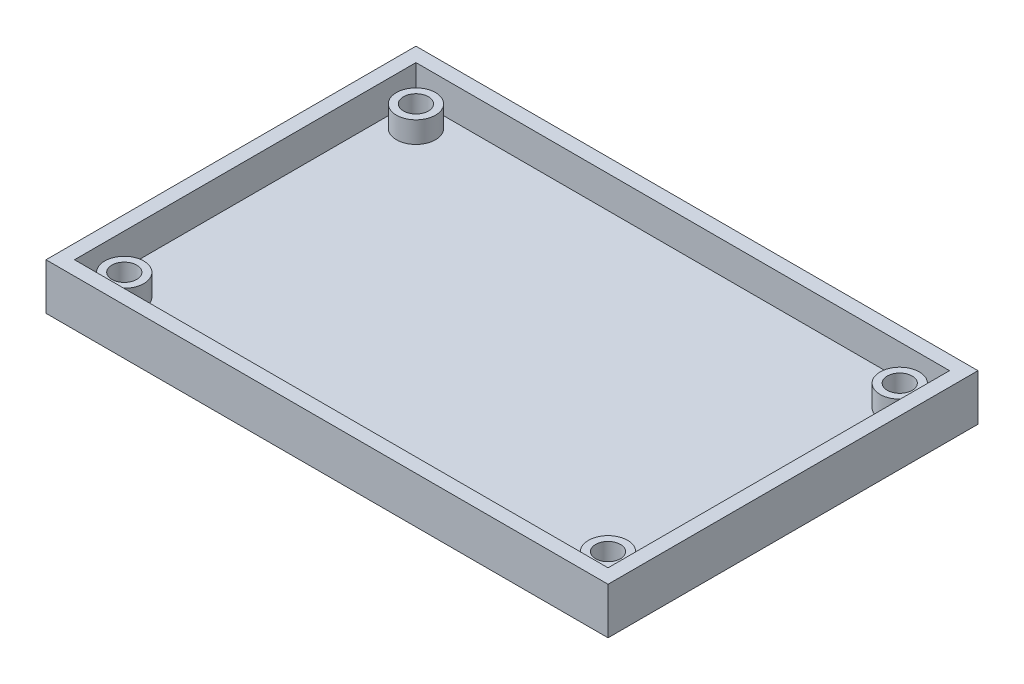
ISO-10303-21;
HEADER;
FILE_DESCRIPTION(('STEP AP214'),'2;1');
FILE_NAME('part.step','',(''),(''),'','','');
FILE_SCHEMA(('AUTOMOTIVE_DESIGN { 1 0 10303 214 1 1 1 1 }'));
ENDSEC;
DATA;
#1=APPLICATION_CONTEXT('core data for automotive mechanical design processes');
#2=APPLICATION_PROTOCOL_DEFINITION('international standard','automotive_design',2000,#1);
#3=PRODUCT_CONTEXT('',#1,'mechanical');
#4=PRODUCT('Part','Part','',(#3));
#5=PRODUCT_RELATED_PRODUCT_CATEGORY('part','',(#4));
#6=PRODUCT_DEFINITION_FORMATION('','',#4);
#7=PRODUCT_DEFINITION_CONTEXT('part definition',#1,'design');
#8=PRODUCT_DEFINITION('design','',#6,#7);
#9=PRODUCT_DEFINITION_SHAPE('','',#8);
#10=(LENGTH_UNIT() NAMED_UNIT(*) SI_UNIT(.MILLI.,.METRE.));
#11=(NAMED_UNIT(*) PLANE_ANGLE_UNIT() SI_UNIT($,.RADIAN.));
#12=(NAMED_UNIT(*) SI_UNIT($,.STERADIAN.) SOLID_ANGLE_UNIT());
#13=UNCERTAINTY_MEASURE_WITH_UNIT(LENGTH_MEASURE(1.E-05),#10,'distance_accuracy_value','');
#14=(GEOMETRIC_REPRESENTATION_CONTEXT(3) GLOBAL_UNCERTAINTY_ASSIGNED_CONTEXT((#13)) GLOBAL_UNIT_ASSIGNED_CONTEXT((#10,
#11,#12)) REPRESENTATION_CONTEXT('',''));
#15=CARTESIAN_POINT('',(0.,0.,0.));
#16=DIRECTION('',(0.,0.,1.));
#17=DIRECTION('',(1.,0.,0.));
#18=AXIS2_PLACEMENT_3D('',#15,#16,#17);
#19=CARTESIAN_POINT('',(0.,4.524,0.));
#20=DIRECTION('',(0.,1.,0.));
#21=DIRECTION('',(0.,0.,1.));
#22=AXIS2_PLACEMENT_3D('',#19,#20,#21);
#23=PLANE('',#22);
#24=DIRECTION('',(0.,0.,-1.));
#25=VECTOR('',#24,1.);
#26=CARTESIAN_POINT('',(39.5,4.524,-26.));
#27=LINE('',#26,#25);
#28=CARTESIAN_POINT('',(39.5,4.524,26.));
#29=VERTEX_POINT('',#28);
#30=CARTESIAN_POINT('',(39.5,4.524,-26.));
#31=VERTEX_POINT('',#30);
#32=EDGE_CURVE('E159',#29,#31,#27,.T.);
#33=ORIENTED_EDGE('',*,*,#32,.T.);
#34=DIRECTION('',(-1.,0.,0.));
#35=VECTOR('',#34,1.);
#36=CARTESIAN_POINT('',(-39.5,4.524,-26.));
#37=LINE('',#36,#35);
#38=CARTESIAN_POINT('',(-39.5,4.524,-26.));
#39=VERTEX_POINT('',#38);
#40=EDGE_CURVE('E161',#31,#39,#37,.T.);
#41=ORIENTED_EDGE('',*,*,#40,.T.);
#42=DIRECTION('',(0.,0.,1.));
#43=VECTOR('',#42,1.);
#44=CARTESIAN_POINT('',(-39.5,4.524,-26.));
#45=LINE('',#44,#43);
#46=CARTESIAN_POINT('',(-39.5,4.524,26.));
#47=VERTEX_POINT('',#46);
#48=EDGE_CURVE('E106',#39,#47,#45,.T.);
#49=ORIENTED_EDGE('',*,*,#48,.T.);
#50=DIRECTION('',(1.,0.,0.));
#51=VECTOR('',#50,1.);
#52=CARTESIAN_POINT('',(-39.5,4.524,26.));
#53=LINE('',#52,#51);
#54=EDGE_CURVE('E58',#47,#29,#53,.T.);
#55=ORIENTED_EDGE('',*,*,#54,.T.);
#56=EDGE_LOOP('',(#33,#41,#49,#55));
#57=FACE_BOUND('',#56,.T.);
#58=DIRECTION('',(-1.,0.,0.));
#59=VECTOR('',#58,1.);
#60=CARTESIAN_POINT('',(-37.5,4.524,-24.));
#61=LINE('',#60,#59);
#62=CARTESIAN_POINT('',(37.5,4.524,-24.));
#63=VERTEX_POINT('',#62);
#64=CARTESIAN_POINT('',(-37.5,4.524,-24.));
#65=VERTEX_POINT('',#64);
#66=EDGE_CURVE('E134',#63,#65,#61,.T.);
#67=ORIENTED_EDGE('',*,*,#66,.F.);
#68=DIRECTION('',(0.,0.,-1.));
#69=VECTOR('',#68,1.);
#70=CARTESIAN_POINT('',(37.5,4.524,-24.));
#71=LINE('',#70,#69);
#72=CARTESIAN_POINT('',(37.5,4.524,24.));
#73=VERTEX_POINT('',#72);
#74=EDGE_CURVE('E132',#73,#63,#71,.T.);
#75=ORIENTED_EDGE('',*,*,#74,.F.);
#76=DIRECTION('',(1.,0.,0.));
#77=VECTOR('',#76,1.);
#78=CARTESIAN_POINT('',(-37.5,4.524,24.));
#79=LINE('',#78,#77);
#80=CARTESIAN_POINT('',(-37.5,4.524,24.));
#81=VERTEX_POINT('',#80);
#82=EDGE_CURVE('E139',#81,#73,#79,.T.);
#83=ORIENTED_EDGE('',*,*,#82,.F.);
#84=DIRECTION('',(0.,0.,1.));
#85=VECTOR('',#84,1.);
#86=CARTESIAN_POINT('',(-37.5,4.524,-24.));
#87=LINE('',#86,#85);
#88=EDGE_CURVE('E137',#65,#81,#87,.T.);
#89=ORIENTED_EDGE('',*,*,#88,.F.);
#90=EDGE_LOOP('',(#67,#75,#83,#89));
#91=FACE_BOUND('',#90,.T.);
#92=ADVANCED_FACE('F35',(#57,#91),#23,.T.);
#93=CARTESIAN_POINT('',(39.5,4.524,-26.));
#94=DIRECTION('',(-1.,0.,0.));
#95=DIRECTION('',(0.,0.,1.));
#96=AXIS2_PLACEMENT_3D('',#93,#94,#95);
#97=PLANE('',#96);
#98=DIRECTION('',(0.,-1.,0.));
#99=VECTOR('',#98,1.);
#100=CARTESIAN_POINT('',(39.5,4.524,26.));
#101=LINE('',#100,#99);
#102=CARTESIAN_POINT('',(39.5,-2.,26.));
#103=VERTEX_POINT('',#102);
#104=EDGE_CURVE('E165',#29,#103,#101,.T.);
#105=ORIENTED_EDGE('',*,*,#104,.T.);
#106=DIRECTION('',(0.,0.,1.));
#107=VECTOR('',#106,1.);
#108=CARTESIAN_POINT('',(39.5,-2.,26.));
#109=LINE('',#108,#107);
#110=CARTESIAN_POINT('',(39.5,-2.,-26.));
#111=VERTEX_POINT('',#110);
#112=EDGE_CURVE('E116',#111,#103,#109,.T.);
#113=ORIENTED_EDGE('',*,*,#112,.F.);
#114=DIRECTION('',(0.,-1.,0.));
#115=VECTOR('',#114,1.);
#116=CARTESIAN_POINT('',(39.5,4.524,-26.));
#117=LINE('',#116,#115);
#118=EDGE_CURVE('E11',#31,#111,#117,.T.);
#119=ORIENTED_EDGE('',*,*,#118,.F.);
#120=ORIENTED_EDGE('',*,*,#32,.F.);
#121=EDGE_LOOP('',(#105,#113,#119,#120));
#122=FACE_BOUND('',#121,.T.);
#123=ADVANCED_FACE('F37',(#122),#97,.F.);
#124=CARTESIAN_POINT('',(-39.5,4.524,-26.));
#125=DIRECTION('',(0.,0.,1.));
#126=DIRECTION('',(1.,0.,0.));
#127=AXIS2_PLACEMENT_3D('',#124,#125,#126);
#128=PLANE('',#127);
#129=ORIENTED_EDGE('',*,*,#118,.T.);
#130=DIRECTION('',(1.,0.,0.));
#131=VECTOR('',#130,1.);
#132=CARTESIAN_POINT('',(39.5,-2.,-26.));
#133=LINE('',#132,#131);
#134=CARTESIAN_POINT('',(-39.5,-2.,-26.));
#135=VERTEX_POINT('',#134);
#136=EDGE_CURVE('E110',#135,#111,#133,.T.);
#137=ORIENTED_EDGE('',*,*,#136,.F.);
#138=DIRECTION('',(0.,-1.,0.));
#139=VECTOR('',#138,1.);
#140=CARTESIAN_POINT('',(-39.5,4.524,-26.));
#141=LINE('',#140,#139);
#142=EDGE_CURVE('E43',#39,#135,#141,.T.);
#143=ORIENTED_EDGE('',*,*,#142,.F.);
#144=ORIENTED_EDGE('',*,*,#40,.F.);
#145=EDGE_LOOP('',(#129,#137,#143,#144));
#146=FACE_BOUND('',#145,.T.);
#147=ADVANCED_FACE('F111',(#146),#128,.F.);
#148=CARTESIAN_POINT('',(-39.5,4.524,-26.));
#149=DIRECTION('',(1.,0.,0.));
#150=DIRECTION('',(0.,0.,-1.));
#151=AXIS2_PLACEMENT_3D('',#148,#149,#150);
#152=PLANE('',#151);
#153=ORIENTED_EDGE('',*,*,#142,.T.);
#154=DIRECTION('',(0.,0.,-1.));
#155=VECTOR('',#154,1.);
#156=CARTESIAN_POINT('',(-39.5,-2.,26.));
#157=LINE('',#156,#155);
#158=CARTESIAN_POINT('',(-39.5,-2.,26.));
#159=VERTEX_POINT('',#158);
#160=EDGE_CURVE('E105',#159,#135,#157,.T.);
#161=ORIENTED_EDGE('',*,*,#160,.F.);
#162=DIRECTION('',(0.,-1.,0.));
#163=VECTOR('',#162,1.);
#164=CARTESIAN_POINT('',(-39.5,4.524,26.));
#165=LINE('',#164,#163);
#166=EDGE_CURVE('E108',#47,#159,#165,.T.);
#167=ORIENTED_EDGE('',*,*,#166,.F.);
#168=ORIENTED_EDGE('',*,*,#48,.F.);
#169=EDGE_LOOP('',(#153,#161,#167,#168));
#170=FACE_BOUND('',#169,.T.);
#171=ADVANCED_FACE('F102',(#170),#152,.F.);
#172=CARTESIAN_POINT('',(-39.5,4.524,26.));
#173=DIRECTION('',(0.,0.,-1.));
#174=DIRECTION('',(-1.,0.,0.));
#175=AXIS2_PLACEMENT_3D('',#172,#173,#174);
#176=PLANE('',#175);
#177=ORIENTED_EDGE('',*,*,#166,.T.);
#178=DIRECTION('',(-1.,0.,0.));
#179=VECTOR('',#178,1.);
#180=CARTESIAN_POINT('',(39.5,-2.,26.));
#181=LINE('',#180,#179);
#182=EDGE_CURVE('E121',#103,#159,#181,.T.);
#183=ORIENTED_EDGE('',*,*,#182,.F.);
#184=ORIENTED_EDGE('',*,*,#104,.F.);
#185=ORIENTED_EDGE('',*,*,#54,.F.);
#186=EDGE_LOOP('',(#177,#183,#184,#185));
#187=FACE_BOUND('',#186,.T.);
#188=ADVANCED_FACE('F168',(#187),#176,.F.);
#189=CARTESIAN_POINT('',(37.5,4.524,-24.));
#190=DIRECTION('',(-1.,0.,0.));
#191=DIRECTION('',(0.,0.,1.));
#192=AXIS2_PLACEMENT_3D('',#189,#190,#191);
#193=PLANE('',#192);
#194=DIRECTION('',(0.,0.,-1.));
#195=VECTOR('',#194,1.);
#196=CARTESIAN_POINT('',(37.5,0.,-24.));
#197=LINE('',#196,#195);
#198=CARTESIAN_POINT('',(37.5,0.,24.));
#199=VERTEX_POINT('',#198);
#200=CARTESIAN_POINT('',(37.5,0.,-24.));
#201=VERTEX_POINT('',#200);
#202=EDGE_CURVE('E131',#199,#201,#197,.T.);
#203=ORIENTED_EDGE('',*,*,#202,.F.);
#204=DIRECTION('',(0.,-1.,0.));
#205=VECTOR('',#204,1.);
#206=CARTESIAN_POINT('',(37.5,4.524,24.));
#207=LINE('',#206,#205);
#208=EDGE_CURVE('E141',#73,#199,#207,.T.);
#209=ORIENTED_EDGE('',*,*,#208,.F.);
#210=ORIENTED_EDGE('',*,*,#74,.T.);
#211=DIRECTION('',(0.,-1.,0.));
#212=VECTOR('',#211,1.);
#213=CARTESIAN_POINT('',(37.5,4.524,-24.));
#214=LINE('',#213,#212);
#215=EDGE_CURVE('E156',#63,#201,#214,.T.);
#216=ORIENTED_EDGE('',*,*,#215,.T.);
#217=EDGE_LOOP('',(#203,#209,#210,#216));
#218=FACE_BOUND('',#217,.T.);
#219=ADVANCED_FACE('F189',(#218),#193,.T.);
#220=CARTESIAN_POINT('',(-37.5,4.524,-24.));
#221=DIRECTION('',(0.,0.,1.));
#222=DIRECTION('',(1.,0.,0.));
#223=AXIS2_PLACEMENT_3D('',#220,#221,#222);
#224=PLANE('',#223);
#225=DIRECTION('',(-1.,0.,0.));
#226=VECTOR('',#225,1.);
#227=CARTESIAN_POINT('',(-37.5,0.,-24.));
#228=LINE('',#227,#226);
#229=CARTESIAN_POINT('',(-37.5,0.,-24.));
#230=VERTEX_POINT('',#229);
#231=EDGE_CURVE('E144',#201,#230,#228,.T.);
#232=ORIENTED_EDGE('',*,*,#231,.F.);
#233=ORIENTED_EDGE('',*,*,#215,.F.);
#234=ORIENTED_EDGE('',*,*,#66,.T.);
#235=DIRECTION('',(0.,-1.,0.));
#236=VECTOR('',#235,1.);
#237=CARTESIAN_POINT('',(-37.5,4.524,-24.));
#238=LINE('',#237,#236);
#239=EDGE_CURVE('E154',#65,#230,#238,.T.);
#240=ORIENTED_EDGE('',*,*,#239,.T.);
#241=EDGE_LOOP('',(#232,#233,#234,#240));
#242=FACE_BOUND('',#241,.T.);
#243=ADVANCED_FACE('F181',(#242),#224,.T.);
#244=CARTESIAN_POINT('',(-37.5,4.524,-24.));
#245=DIRECTION('',(1.,0.,0.));
#246=DIRECTION('',(0.,0.,-1.));
#247=AXIS2_PLACEMENT_3D('',#244,#245,#246);
#248=PLANE('',#247);
#249=DIRECTION('',(0.,0.,1.));
#250=VECTOR('',#249,1.);
#251=CARTESIAN_POINT('',(-37.5,0.,-24.));
#252=LINE('',#251,#250);
#253=CARTESIAN_POINT('',(-37.5,0.,24.));
#254=VERTEX_POINT('',#253);
#255=EDGE_CURVE('E147',#230,#254,#252,.T.);
#256=ORIENTED_EDGE('',*,*,#255,.F.);
#257=ORIENTED_EDGE('',*,*,#239,.F.);
#258=ORIENTED_EDGE('',*,*,#88,.T.);
#259=DIRECTION('',(0.,-1.,0.));
#260=VECTOR('',#259,1.);
#261=CARTESIAN_POINT('',(-37.5,4.524,24.));
#262=LINE('',#261,#260);
#263=EDGE_CURVE('E50',#81,#254,#262,.T.);
#264=ORIENTED_EDGE('',*,*,#263,.T.);
#265=EDGE_LOOP('',(#256,#257,#258,#264));
#266=FACE_BOUND('',#265,.T.);
#267=ADVANCED_FACE('F184',(#266),#248,.T.);
#268=CARTESIAN_POINT('',(-37.5,4.524,24.));
#269=DIRECTION('',(0.,0.,-1.));
#270=DIRECTION('',(-1.,0.,0.));
#271=AXIS2_PLACEMENT_3D('',#268,#269,#270);
#272=PLANE('',#271);
#273=DIRECTION('',(1.,0.,0.));
#274=VECTOR('',#273,1.);
#275=CARTESIAN_POINT('',(-37.5,0.,24.));
#276=LINE('',#275,#274);
#277=EDGE_CURVE('E135',#254,#199,#276,.T.);
#278=ORIENTED_EDGE('',*,*,#277,.F.);
#279=ORIENTED_EDGE('',*,*,#263,.F.);
#280=ORIENTED_EDGE('',*,*,#82,.T.);
#281=ORIENTED_EDGE('',*,*,#208,.T.);
#282=EDGE_LOOP('',(#278,#279,#280,#281));
#283=FACE_BOUND('',#282,.T.);
#284=ADVANCED_FACE('F191',(#283),#272,.T.);
#285=CARTESIAN_POINT('',(0.,0.,0.));
#286=DIRECTION('',(0.,1.,0.));
#287=DIRECTION('',(0.,0.,1.));
#288=AXIS2_PLACEMENT_3D('',#285,#286,#287);
#289=PLANE('',#288);
#290=CARTESIAN_POINT('',(-34.,0.,-20.5));
#291=DIRECTION('',(0.,1.,0.));
#292=DIRECTION('',(0.,0.,1.));
#293=AXIS2_PLACEMENT_3D('',#290,#291,#292);
#294=CIRCLE('',#293,2.75000000000001);
#295=CARTESIAN_POINT('',(-34.,0.,-17.75));
#296=VERTEX_POINT('',#295);
#297=EDGE_CURVE('E490',#296,#296,#294,.T.);
#298=ORIENTED_EDGE('',*,*,#297,.F.);
#299=EDGE_LOOP('',(#298));
#300=FACE_BOUND('',#299,.T.);
#301=CARTESIAN_POINT('',(34.,0.,-20.5));
#302=DIRECTION('',(0.,1.,0.));
#303=DIRECTION('',(0.,0.,1.));
#304=AXIS2_PLACEMENT_3D('',#301,#302,#303);
#305=CIRCLE('',#304,2.75);
#306=CARTESIAN_POINT('',(34.,0.,-17.75));
#307=VERTEX_POINT('',#306);
#308=EDGE_CURVE('E505',#307,#307,#305,.T.);
#309=ORIENTED_EDGE('',*,*,#308,.F.);
#310=EDGE_LOOP('',(#309));
#311=FACE_BOUND('',#310,.T.);
#312=CARTESIAN_POINT('',(34.,0.,20.5));
#313=DIRECTION('',(0.,1.,0.));
#314=DIRECTION('',(0.,0.,1.));
#315=AXIS2_PLACEMENT_3D('',#312,#313,#314);
#316=CIRCLE('',#315,2.75);
#317=CARTESIAN_POINT('',(34.,0.,23.25));
#318=VERTEX_POINT('',#317);
#319=EDGE_CURVE('E520',#318,#318,#316,.T.);
#320=ORIENTED_EDGE('',*,*,#319,.F.);
#321=EDGE_LOOP('',(#320));
#322=FACE_BOUND('',#321,.T.);
#323=CARTESIAN_POINT('',(-34.,0.,20.5));
#324=DIRECTION('',(0.,1.,0.));
#325=DIRECTION('',(0.,0.,1.));
#326=AXIS2_PLACEMENT_3D('',#323,#324,#325);
#327=CIRCLE('',#326,2.75);
#328=CARTESIAN_POINT('',(-34.,0.,23.25));
#329=VERTEX_POINT('',#328);
#330=EDGE_CURVE('E535',#329,#329,#327,.T.);
#331=ORIENTED_EDGE('',*,*,#330,.F.);
#332=EDGE_LOOP('',(#331));
#333=FACE_BOUND('',#332,.T.);
#334=ORIENTED_EDGE('',*,*,#277,.T.);
#335=ORIENTED_EDGE('',*,*,#202,.T.);
#336=ORIENTED_EDGE('',*,*,#231,.T.);
#337=ORIENTED_EDGE('',*,*,#255,.T.);
#338=EDGE_LOOP('',(#334,#335,#336,#337));
#339=FACE_BOUND('',#338,.T.);
#340=ADVANCED_FACE('F186',(#300,#311,#322,#333,#339),#289,.T.);
#341=CARTESIAN_POINT('',(0.,-2.,0.));
#342=DIRECTION('',(0.,1.,0.));
#343=DIRECTION('',(0.,0.,1.));
#344=AXIS2_PLACEMENT_3D('',#341,#342,#343);
#345=PLANE('',#344);
#346=CARTESIAN_POINT('',(34.,-2.,-20.5));
#347=DIRECTION('',(0.,1.,0.));
#348=DIRECTION('',(0.,0.,1.));
#349=AXIS2_PLACEMENT_3D('',#346,#347,#348);
#350=CIRCLE('',#349,1.9);
#351=CARTESIAN_POINT('',(34.,-2.,-18.6));
#352=VERTEX_POINT('',#351);
#353=EDGE_CURVE('E125',#352,#352,#350,.T.);
#354=ORIENTED_EDGE('',*,*,#353,.T.);
#355=EDGE_LOOP('',(#354));
#356=FACE_BOUND('',#355,.T.);
#357=CARTESIAN_POINT('',(34.,-2.,20.5));
#358=DIRECTION('',(0.,1.,0.));
#359=DIRECTION('',(0.,0.,1.));
#360=AXIS2_PLACEMENT_3D('',#357,#358,#359);
#361=CIRCLE('',#360,1.9);
#362=CARTESIAN_POINT('',(34.,-2.,22.4));
#363=VERTEX_POINT('',#362);
#364=EDGE_CURVE('E549',#363,#363,#361,.T.);
#365=ORIENTED_EDGE('',*,*,#364,.T.);
#366=EDGE_LOOP('',(#365));
#367=FACE_BOUND('',#366,.T.);
#368=CARTESIAN_POINT('',(-34.,-2.,20.5));
#369=DIRECTION('',(0.,1.,0.));
#370=DIRECTION('',(0.,0.,1.));
#371=AXIS2_PLACEMENT_3D('',#368,#369,#370);
#372=CIRCLE('',#371,1.9);
#373=CARTESIAN_POINT('',(-34.,-2.,22.4));
#374=VERTEX_POINT('',#373);
#375=EDGE_CURVE('E546',#374,#374,#372,.T.);
#376=ORIENTED_EDGE('',*,*,#375,.T.);
#377=EDGE_LOOP('',(#376));
#378=FACE_BOUND('',#377,.T.);
#379=CARTESIAN_POINT('',(-34.,-2.,-20.5));
#380=DIRECTION('',(0.,1.,0.));
#381=DIRECTION('',(0.,0.,1.));
#382=AXIS2_PLACEMENT_3D('',#379,#380,#381);
#383=CIRCLE('',#382,1.9);
#384=CARTESIAN_POINT('',(-34.,-2.,-18.6));
#385=VERTEX_POINT('',#384);
#386=EDGE_CURVE('E122',#385,#385,#383,.T.);
#387=ORIENTED_EDGE('',*,*,#386,.T.);
#388=EDGE_LOOP('',(#387));
#389=FACE_BOUND('',#388,.T.);
#390=ORIENTED_EDGE('',*,*,#160,.T.);
#391=ORIENTED_EDGE('',*,*,#136,.T.);
#392=ORIENTED_EDGE('',*,*,#112,.T.);
#393=ORIENTED_EDGE('',*,*,#182,.T.);
#394=EDGE_LOOP('',(#390,#391,#392,#393));
#395=FACE_BOUND('',#394,.T.);
#396=ADVANCED_FACE('F119',(#356,#367,#378,#389,#395),#345,.F.);
#397=CARTESIAN_POINT('',(-34.,-2.,-20.5));
#398=DIRECTION('',(0.,1.,0.));
#399=DIRECTION('',(0.,0.,1.));
#400=AXIS2_PLACEMENT_3D('',#397,#398,#399);
#401=CYLINDRICAL_SURFACE('',#400,1.9);
#402=ORIENTED_EDGE('',*,*,#386,.F.);
#403=EDGE_LOOP('',(#402));
#404=FACE_BOUND('',#403,.T.);
#405=CARTESIAN_POINT('',(-34.,0.,-20.5));
#406=DIRECTION('',(0.,1.,0.));
#407=DIRECTION('',(0.,0.,1.));
#408=AXIS2_PLACEMENT_3D('',#405,#406,#407);
#409=CIRCLE('',#408,1.9);
#410=CARTESIAN_POINT('',(-34.,0.,-18.6));
#411=VERTEX_POINT('',#410);
#412=EDGE_CURVE('E496',#411,#411,#409,.F.);
#413=ORIENTED_EDGE('',*,*,#412,.F.);
#414=EDGE_LOOP('',(#413));
#415=FACE_BOUND('',#414,.T.);
#416=ADVANCED_FACE('F274',(#404,#415),#401,.F.);
#417=CARTESIAN_POINT('',(-34.,-2.,20.5));
#418=DIRECTION('',(0.,1.,0.));
#419=DIRECTION('',(0.,0.,1.));
#420=AXIS2_PLACEMENT_3D('',#417,#418,#419);
#421=CYLINDRICAL_SURFACE('',#420,1.9);
#422=ORIENTED_EDGE('',*,*,#375,.F.);
#423=EDGE_LOOP('',(#422));
#424=FACE_BOUND('',#423,.T.);
#425=CARTESIAN_POINT('',(-34.,0.,20.5));
#426=DIRECTION('',(0.,1.,0.));
#427=DIRECTION('',(0.,0.,1.));
#428=AXIS2_PLACEMENT_3D('',#425,#426,#427);
#429=CIRCLE('',#428,1.9);
#430=CARTESIAN_POINT('',(-34.,0.,22.4));
#431=VERTEX_POINT('',#430);
#432=EDGE_CURVE('E541',#431,#431,#429,.F.);
#433=ORIENTED_EDGE('',*,*,#432,.F.);
#434=EDGE_LOOP('',(#433));
#435=FACE_BOUND('',#434,.T.);
#436=ADVANCED_FACE('F283',(#424,#435),#421,.F.);
#437=CARTESIAN_POINT('',(34.,-2.,20.5));
#438=DIRECTION('',(0.,1.,0.));
#439=DIRECTION('',(0.,0.,1.));
#440=AXIS2_PLACEMENT_3D('',#437,#438,#439);
#441=CYLINDRICAL_SURFACE('',#440,1.9);
#442=ORIENTED_EDGE('',*,*,#364,.F.);
#443=EDGE_LOOP('',(#442));
#444=FACE_BOUND('',#443,.T.);
#445=CARTESIAN_POINT('',(34.,0.,20.5));
#446=DIRECTION('',(0.,1.,0.));
#447=DIRECTION('',(0.,0.,1.));
#448=AXIS2_PLACEMENT_3D('',#445,#446,#447);
#449=CIRCLE('',#448,1.9);
#450=CARTESIAN_POINT('',(34.,0.,22.4));
#451=VERTEX_POINT('',#450);
#452=EDGE_CURVE('E526',#451,#451,#449,.F.);
#453=ORIENTED_EDGE('',*,*,#452,.F.);
#454=EDGE_LOOP('',(#453));
#455=FACE_BOUND('',#454,.T.);
#456=ADVANCED_FACE('F293',(#444,#455),#441,.F.);
#457=CARTESIAN_POINT('',(34.,-2.,-20.5));
#458=DIRECTION('',(0.,1.,0.));
#459=DIRECTION('',(0.,0.,1.));
#460=AXIS2_PLACEMENT_3D('',#457,#458,#459);
#461=CYLINDRICAL_SURFACE('',#460,1.9);
#462=ORIENTED_EDGE('',*,*,#353,.F.);
#463=EDGE_LOOP('',(#462));
#464=FACE_BOUND('',#463,.T.);
#465=CARTESIAN_POINT('',(34.,0.,-20.5));
#466=DIRECTION('',(0.,1.,0.));
#467=DIRECTION('',(0.,0.,1.));
#468=AXIS2_PLACEMENT_3D('',#465,#466,#467);
#469=CIRCLE('',#468,1.9);
#470=CARTESIAN_POINT('',(34.,0.,-18.6));
#471=VERTEX_POINT('',#470);
#472=EDGE_CURVE('E511',#471,#471,#469,.F.);
#473=ORIENTED_EDGE('',*,*,#472,.F.);
#474=EDGE_LOOP('',(#473));
#475=FACE_BOUND('',#474,.T.);
#476=ADVANCED_FACE('F303',(#464,#475),#461,.F.);
#477=CARTESIAN_POINT('',(-34.,0.,20.5));
#478=DIRECTION('',(0.,1.,0.));
#479=DIRECTION('',(0.,0.,1.));
#480=AXIS2_PLACEMENT_3D('',#477,#478,#479);
#481=PLANE('',#480);
#482=CARTESIAN_POINT('',(-34.,0.,20.5));
#483=DIRECTION('',(0.,1.,0.));
#484=DIRECTION('',(0.,0.,1.));
#485=AXIS2_PLACEMENT_3D('',#482,#483,#484);
#486=CIRCLE('',#485,1.75);
#487=CARTESIAN_POINT('',(-34.,0.,22.25));
#488=VERTEX_POINT('',#487);
#489=EDGE_CURVE('E531',#488,#488,#486,.T.);
#490=ORIENTED_EDGE('',*,*,#489,.T.);
#491=EDGE_LOOP('',(#490));
#492=FACE_BOUND('',#491,.T.);
#493=ORIENTED_EDGE('',*,*,#432,.T.);
#494=EDGE_LOOP('',(#493));
#495=FACE_BOUND('',#494,.T.);
#496=ADVANCED_FACE('F313',(#492,#495),#481,.F.);
#497=CARTESIAN_POINT('',(-34.,3.,20.5));
#498=DIRECTION('',(0.,1.,0.));
#499=DIRECTION('',(0.,0.,1.));
#500=AXIS2_PLACEMENT_3D('',#497,#498,#499);
#501=PLANE('',#500);
#502=CARTESIAN_POINT('',(-34.,3.,20.5));
#503=DIRECTION('',(0.,1.,0.));
#504=DIRECTION('',(0.,0.,1.));
#505=AXIS2_PLACEMENT_3D('',#502,#503,#504);
#506=CIRCLE('',#505,2.75);
#507=CARTESIAN_POINT('',(-34.,3.,23.25));
#508=VERTEX_POINT('',#507);
#509=EDGE_CURVE('E538',#508,#508,#506,.T.);
#510=ORIENTED_EDGE('',*,*,#509,.T.);
#511=EDGE_LOOP('',(#510));
#512=FACE_BOUND('',#511,.T.);
#513=CARTESIAN_POINT('',(-34.,3.,20.5));
#514=DIRECTION('',(0.,1.,0.));
#515=DIRECTION('',(0.,0.,1.));
#516=AXIS2_PLACEMENT_3D('',#513,#514,#515);
#517=CIRCLE('',#516,1.75);
#518=CARTESIAN_POINT('',(-34.,3.,22.25));
#519=VERTEX_POINT('',#518);
#520=EDGE_CURVE('E532',#519,#519,#517,.T.);
#521=ORIENTED_EDGE('',*,*,#520,.F.);
#522=EDGE_LOOP('',(#521));
#523=FACE_BOUND('',#522,.T.);
#524=ADVANCED_FACE('F328',(#512,#523),#501,.T.);
#525=CARTESIAN_POINT('',(-34.,3.,20.5));
#526=DIRECTION('',(0.,-1.,0.));
#527=DIRECTION('',(0.,0.,-1.));
#528=AXIS2_PLACEMENT_3D('',#525,#526,#527);
#529=CYLINDRICAL_SURFACE('',#528,2.75);
#530=ORIENTED_EDGE('',*,*,#509,.F.);
#531=EDGE_LOOP('',(#530));
#532=FACE_BOUND('',#531,.T.);
#533=ORIENTED_EDGE('',*,*,#330,.T.);
#534=EDGE_LOOP('',(#533));
#535=FACE_BOUND('',#534,.T.);
#536=ADVANCED_FACE('F338',(#532,#535),#529,.T.);
#537=CARTESIAN_POINT('',(-34.,3.,20.5));
#538=DIRECTION('',(0.,-1.,0.));
#539=DIRECTION('',(0.,0.,-1.));
#540=AXIS2_PLACEMENT_3D('',#537,#538,#539);
#541=CYLINDRICAL_SURFACE('',#540,1.75);
#542=ORIENTED_EDGE('',*,*,#520,.T.);
#543=EDGE_LOOP('',(#542));
#544=FACE_BOUND('',#543,.T.);
#545=ORIENTED_EDGE('',*,*,#489,.F.);
#546=EDGE_LOOP('',(#545));
#547=FACE_BOUND('',#546,.T.);
#548=ADVANCED_FACE('F348',(#544,#547),#541,.F.);
#549=CARTESIAN_POINT('',(34.,0.,20.5));
#550=DIRECTION('',(0.,1.,0.));
#551=DIRECTION('',(0.,0.,1.));
#552=AXIS2_PLACEMENT_3D('',#549,#550,#551);
#553=PLANE('',#552);
#554=CARTESIAN_POINT('',(34.,0.,20.5));
#555=DIRECTION('',(0.,1.,0.));
#556=DIRECTION('',(0.,0.,1.));
#557=AXIS2_PLACEMENT_3D('',#554,#555,#556);
#558=CIRCLE('',#557,1.75);
#559=CARTESIAN_POINT('',(34.,0.,22.25));
#560=VERTEX_POINT('',#559);
#561=EDGE_CURVE('E516',#560,#560,#558,.T.);
#562=ORIENTED_EDGE('',*,*,#561,.T.);
#563=EDGE_LOOP('',(#562));
#564=FACE_BOUND('',#563,.T.);
#565=ORIENTED_EDGE('',*,*,#452,.T.);
#566=EDGE_LOOP('',(#565));
#567=FACE_BOUND('',#566,.T.);
#568=ADVANCED_FACE('F358',(#564,#567),#553,.F.);
#569=CARTESIAN_POINT('',(34.,3.,20.5));
#570=DIRECTION('',(0.,1.,0.));
#571=DIRECTION('',(0.,0.,1.));
#572=AXIS2_PLACEMENT_3D('',#569,#570,#571);
#573=PLANE('',#572);
#574=CARTESIAN_POINT('',(34.,3.,20.5));
#575=DIRECTION('',(0.,1.,0.));
#576=DIRECTION('',(0.,0.,1.));
#577=AXIS2_PLACEMENT_3D('',#574,#575,#576);
#578=CIRCLE('',#577,2.75);
#579=CARTESIAN_POINT('',(34.,3.,23.25));
#580=VERTEX_POINT('',#579);
#581=EDGE_CURVE('E523',#580,#580,#578,.T.);
#582=ORIENTED_EDGE('',*,*,#581,.T.);
#583=EDGE_LOOP('',(#582));
#584=FACE_BOUND('',#583,.T.);
#585=CARTESIAN_POINT('',(34.,3.,20.5));
#586=DIRECTION('',(0.,1.,0.));
#587=DIRECTION('',(0.,0.,1.));
#588=AXIS2_PLACEMENT_3D('',#585,#586,#587);
#589=CIRCLE('',#588,1.75);
#590=CARTESIAN_POINT('',(34.,3.,22.25));
#591=VERTEX_POINT('',#590);
#592=EDGE_CURVE('E517',#591,#591,#589,.T.);
#593=ORIENTED_EDGE('',*,*,#592,.F.);
#594=EDGE_LOOP('',(#593));
#595=FACE_BOUND('',#594,.T.);
#596=ADVANCED_FACE('F368',(#584,#595),#573,.T.);
#597=CARTESIAN_POINT('',(34.,3.,20.5));
#598=DIRECTION('',(0.,-1.,0.));
#599=DIRECTION('',(0.,0.,-1.));
#600=AXIS2_PLACEMENT_3D('',#597,#598,#599);
#601=CYLINDRICAL_SURFACE('',#600,2.75);
#602=ORIENTED_EDGE('',*,*,#581,.F.);
#603=EDGE_LOOP('',(#602));
#604=FACE_BOUND('',#603,.T.);
#605=ORIENTED_EDGE('',*,*,#319,.T.);
#606=EDGE_LOOP('',(#605));
#607=FACE_BOUND('',#606,.T.);
#608=ADVANCED_FACE('F378',(#604,#607),#601,.T.);
#609=CARTESIAN_POINT('',(34.,3.,20.5));
#610=DIRECTION('',(0.,-1.,0.));
#611=DIRECTION('',(0.,0.,-1.));
#612=AXIS2_PLACEMENT_3D('',#609,#610,#611);
#613=CYLINDRICAL_SURFACE('',#612,1.75);
#614=ORIENTED_EDGE('',*,*,#592,.T.);
#615=EDGE_LOOP('',(#614));
#616=FACE_BOUND('',#615,.T.);
#617=ORIENTED_EDGE('',*,*,#561,.F.);
#618=EDGE_LOOP('',(#617));
#619=FACE_BOUND('',#618,.T.);
#620=ADVANCED_FACE('F388',(#616,#619),#613,.F.);
#621=CARTESIAN_POINT('',(34.,0.,-20.5));
#622=DIRECTION('',(0.,1.,0.));
#623=DIRECTION('',(0.,0.,1.));
#624=AXIS2_PLACEMENT_3D('',#621,#622,#623);
#625=PLANE('',#624);
#626=CARTESIAN_POINT('',(34.,0.,-20.5));
#627=DIRECTION('',(0.,1.,0.));
#628=DIRECTION('',(0.,0.,1.));
#629=AXIS2_PLACEMENT_3D('',#626,#627,#628);
#630=CIRCLE('',#629,1.75);
#631=CARTESIAN_POINT('',(34.,0.,-18.75));
#632=VERTEX_POINT('',#631);
#633=EDGE_CURVE('E501',#632,#632,#630,.T.);
#634=ORIENTED_EDGE('',*,*,#633,.T.);
#635=EDGE_LOOP('',(#634));
#636=FACE_BOUND('',#635,.T.);
#637=ORIENTED_EDGE('',*,*,#472,.T.);
#638=EDGE_LOOP('',(#637));
#639=FACE_BOUND('',#638,.T.);
#640=ADVANCED_FACE('F398',(#636,#639),#625,.F.);
#641=CARTESIAN_POINT('',(34.,3.,-20.5));
#642=DIRECTION('',(0.,1.,0.));
#643=DIRECTION('',(0.,0.,1.));
#644=AXIS2_PLACEMENT_3D('',#641,#642,#643);
#645=PLANE('',#644);
#646=CARTESIAN_POINT('',(34.,3.,-20.5));
#647=DIRECTION('',(0.,1.,0.));
#648=DIRECTION('',(0.,0.,1.));
#649=AXIS2_PLACEMENT_3D('',#646,#647,#648);
#650=CIRCLE('',#649,2.75);
#651=CARTESIAN_POINT('',(34.,3.,-17.75));
#652=VERTEX_POINT('',#651);
#653=EDGE_CURVE('E508',#652,#652,#650,.T.);
#654=ORIENTED_EDGE('',*,*,#653,.T.);
#655=EDGE_LOOP('',(#654));
#656=FACE_BOUND('',#655,.T.);
#657=CARTESIAN_POINT('',(34.,3.,-20.5));
#658=DIRECTION('',(0.,1.,0.));
#659=DIRECTION('',(0.,0.,1.));
#660=AXIS2_PLACEMENT_3D('',#657,#658,#659);
#661=CIRCLE('',#660,1.75);
#662=CARTESIAN_POINT('',(34.,3.,-18.75));
#663=VERTEX_POINT('',#662);
#664=EDGE_CURVE('E502',#663,#663,#661,.T.);
#665=ORIENTED_EDGE('',*,*,#664,.F.);
#666=EDGE_LOOP('',(#665));
#667=FACE_BOUND('',#666,.T.);
#668=ADVANCED_FACE('F408',(#656,#667),#645,.T.);
#669=CARTESIAN_POINT('',(34.,3.,-20.5));
#670=DIRECTION('',(0.,-1.,0.));
#671=DIRECTION('',(0.,0.,-1.));
#672=AXIS2_PLACEMENT_3D('',#669,#670,#671);
#673=CYLINDRICAL_SURFACE('',#672,2.75);
#674=ORIENTED_EDGE('',*,*,#653,.F.);
#675=EDGE_LOOP('',(#674));
#676=FACE_BOUND('',#675,.T.);
#677=ORIENTED_EDGE('',*,*,#308,.T.);
#678=EDGE_LOOP('',(#677));
#679=FACE_BOUND('',#678,.T.);
#680=ADVANCED_FACE('F418',(#676,#679),#673,.T.);
#681=CARTESIAN_POINT('',(34.,3.,-20.5));
#682=DIRECTION('',(0.,-1.,0.));
#683=DIRECTION('',(0.,0.,-1.));
#684=AXIS2_PLACEMENT_3D('',#681,#682,#683);
#685=CYLINDRICAL_SURFACE('',#684,1.75);
#686=ORIENTED_EDGE('',*,*,#664,.T.);
#687=EDGE_LOOP('',(#686));
#688=FACE_BOUND('',#687,.T.);
#689=ORIENTED_EDGE('',*,*,#633,.F.);
#690=EDGE_LOOP('',(#689));
#691=FACE_BOUND('',#690,.T.);
#692=ADVANCED_FACE('F428',(#688,#691),#685,.F.);
#693=CARTESIAN_POINT('',(-34.,0.,-20.5));
#694=DIRECTION('',(0.,1.,0.));
#695=DIRECTION('',(0.,0.,1.));
#696=AXIS2_PLACEMENT_3D('',#693,#694,#695);
#697=PLANE('',#696);
#698=CARTESIAN_POINT('',(-34.,0.,-20.5));
#699=DIRECTION('',(0.,1.,0.));
#700=DIRECTION('',(0.,0.,1.));
#701=AXIS2_PLACEMENT_3D('',#698,#699,#700);
#702=CIRCLE('',#701,1.75000000000001);
#703=CARTESIAN_POINT('',(-34.,0.,-18.75));
#704=VERTEX_POINT('',#703);
#705=EDGE_CURVE('E488',#704,#704,#702,.T.);
#706=ORIENTED_EDGE('',*,*,#705,.T.);
#707=EDGE_LOOP('',(#706));
#708=FACE_BOUND('',#707,.T.);
#709=ORIENTED_EDGE('',*,*,#412,.T.);
#710=EDGE_LOOP('',(#709));
#711=FACE_BOUND('',#710,.T.);
#712=ADVANCED_FACE('F438',(#708,#711),#697,.F.);
#713=CARTESIAN_POINT('',(-34.,3.,-20.5));
#714=DIRECTION('',(0.,1.,0.));
#715=DIRECTION('',(0.,0.,1.));
#716=AXIS2_PLACEMENT_3D('',#713,#714,#715);
#717=PLANE('',#716);
#718=CARTESIAN_POINT('',(-34.,3.,-20.5));
#719=DIRECTION('',(0.,1.,0.));
#720=DIRECTION('',(0.,0.,1.));
#721=AXIS2_PLACEMENT_3D('',#718,#719,#720);
#722=CIRCLE('',#721,2.75000000000001);
#723=CARTESIAN_POINT('',(-34.,3.,-17.75));
#724=VERTEX_POINT('',#723);
#725=EDGE_CURVE('E493',#724,#724,#722,.T.);
#726=ORIENTED_EDGE('',*,*,#725,.T.);
#727=EDGE_LOOP('',(#726));
#728=FACE_BOUND('',#727,.T.);
#729=CARTESIAN_POINT('',(-34.,3.,-20.5));
#730=DIRECTION('',(0.,1.,0.));
#731=DIRECTION('',(0.,0.,1.));
#732=AXIS2_PLACEMENT_3D('',#729,#730,#731);
#733=CIRCLE('',#732,1.75000000000001);
#734=CARTESIAN_POINT('',(-34.,3.,-18.75));
#735=VERTEX_POINT('',#734);
#736=EDGE_CURVE('E485',#735,#735,#733,.T.);
#737=ORIENTED_EDGE('',*,*,#736,.F.);
#738=EDGE_LOOP('',(#737));
#739=FACE_BOUND('',#738,.T.);
#740=ADVANCED_FACE('F448',(#728,#739),#717,.T.);
#741=CARTESIAN_POINT('',(-34.,3.,-20.5));
#742=DIRECTION('',(0.,-1.,0.));
#743=DIRECTION('',(0.,0.,-1.));
#744=AXIS2_PLACEMENT_3D('',#741,#742,#743);
#745=CYLINDRICAL_SURFACE('',#744,2.75000000000001);
#746=ORIENTED_EDGE('',*,*,#725,.F.);
#747=EDGE_LOOP('',(#746));
#748=FACE_BOUND('',#747,.T.);
#749=ORIENTED_EDGE('',*,*,#297,.T.);
#750=EDGE_LOOP('',(#749));
#751=FACE_BOUND('',#750,.T.);
#752=ADVANCED_FACE('F458',(#748,#751),#745,.T.);
#753=CARTESIAN_POINT('',(-34.,3.,-20.5));
#754=DIRECTION('',(0.,-1.,0.));
#755=DIRECTION('',(0.,0.,-1.));
#756=AXIS2_PLACEMENT_3D('',#753,#754,#755);
#757=CYLINDRICAL_SURFACE('',#756,1.75000000000001);
#758=ORIENTED_EDGE('',*,*,#736,.T.);
#759=EDGE_LOOP('',(#758));
#760=FACE_BOUND('',#759,.T.);
#761=ORIENTED_EDGE('',*,*,#705,.F.);
#762=EDGE_LOOP('',(#761));
#763=FACE_BOUND('',#762,.T.);
#764=ADVANCED_FACE('F468',(#760,#763),#757,.F.);
#765=CLOSED_SHELL('',(#92,#123,#147,#171,#188,#219,#243,#267,#284,#340,#396,#416,#436,#456,#476,
#496,#524,#536,#548,#568,#596,#608,#620,#640,#668,#680,#692,#712,#740,#752,#764));
#766=MANIFOLD_SOLID_BREP('B2',#765);
#767=ADVANCED_BREP_SHAPE_REPRESENTATION('',(#18,#766),#14);
#768=SHAPE_DEFINITION_REPRESENTATION(#9,#767);
ENDSEC;
END-ISO-10303-21;
